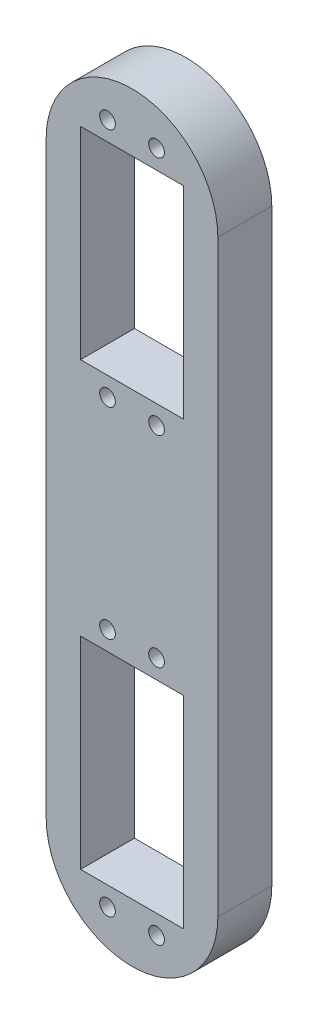
ISO-10303-21;
HEADER;
FILE_DESCRIPTION(('STEP AP214'),'2;1');
FILE_NAME('part.step','',(''),(''),'','','');
FILE_SCHEMA(('AUTOMOTIVE_DESIGN { 1 0 10303 214 1 1 1 1 }'));
ENDSEC;
DATA;
#1=APPLICATION_CONTEXT('core data for automotive mechanical design processes');
#2=APPLICATION_PROTOCOL_DEFINITION('international standard','automotive_design',2000,#1);
#3=PRODUCT_CONTEXT('',#1,'mechanical');
#4=PRODUCT('Part','Part','',(#3));
#5=PRODUCT_RELATED_PRODUCT_CATEGORY('part','',(#4));
#6=PRODUCT_DEFINITION_FORMATION('','',#4);
#7=PRODUCT_DEFINITION_CONTEXT('part definition',#1,'design');
#8=PRODUCT_DEFINITION('design','',#6,#7);
#9=PRODUCT_DEFINITION_SHAPE('','',#8);
#10=(LENGTH_UNIT() NAMED_UNIT(*) SI_UNIT(.MILLI.,.METRE.));
#11=(NAMED_UNIT(*) PLANE_ANGLE_UNIT() SI_UNIT($,.RADIAN.));
#12=(NAMED_UNIT(*) SI_UNIT($,.STERADIAN.) SOLID_ANGLE_UNIT());
#13=UNCERTAINTY_MEASURE_WITH_UNIT(LENGTH_MEASURE(1.E-05),#10,'distance_accuracy_value','');
#14=(GEOMETRIC_REPRESENTATION_CONTEXT(3) GLOBAL_UNCERTAINTY_ASSIGNED_CONTEXT((#13)) GLOBAL_UNIT_ASSIGNED_CONTEXT((#10,
#11,#12)) REPRESENTATION_CONTEXT('',''));
#15=CARTESIAN_POINT('',(0.,0.,0.));
#16=DIRECTION('',(0.,0.,1.));
#17=DIRECTION('',(1.,0.,0.));
#18=AXIS2_PLACEMENT_3D('',#15,#16,#17);
#19=CARTESIAN_POINT('',(-2.50000000000001,-50.,11.));
#20=DIRECTION('',(0.,0.,1.));
#21=DIRECTION('',(1.,0.,0.));
#22=AXIS2_PLACEMENT_3D('',#19,#20,#21);
#23=PLANE('',#22);
#24=CARTESIAN_POINT('',(2.49999999999999,-59.5,11.));
#25=DIRECTION('',(0.,0.,1.));
#26=DIRECTION('',(1.,0.,0.));
#27=AXIS2_PLACEMENT_3D('',#24,#25,#26);
#28=CIRCLE('',#27,1.6);
#29=CARTESIAN_POINT('',(4.09999999999999,-59.5,11.));
#30=VERTEX_POINT('',#29);
#31=EDGE_CURVE('E375',#30,#30,#28,.T.);
#32=ORIENTED_EDGE('',*,*,#31,.F.);
#33=EDGE_LOOP('',(#32));
#34=FACE_BOUND('',#33,.T.);
#35=CARTESIAN_POINT('',(2.49999999999999,-10.5,11.));
#36=DIRECTION('',(0.,0.,1.));
#37=DIRECTION('',(1.,0.,0.));
#38=AXIS2_PLACEMENT_3D('',#35,#36,#37);
#39=CIRCLE('',#38,1.6);
#40=CARTESIAN_POINT('',(4.09999999999999,-10.5,11.));
#41=VERTEX_POINT('',#40);
#42=EDGE_CURVE('E171',#41,#41,#39,.T.);
#43=ORIENTED_EDGE('',*,*,#42,.F.);
#44=EDGE_LOOP('',(#43));
#45=FACE_BOUND('',#44,.T.);
#46=DIRECTION('',(1.,0.,0.));
#47=VECTOR('',#46,1.);
#48=CARTESIAN_POINT('',(0.,-14.4,11.));
#49=LINE('',#48,#47);
#50=CARTESIAN_POINT('',(-13.,-14.4,11.));
#51=VERTEX_POINT('',#50);
#52=CARTESIAN_POINT('',(8.,-14.4,11.));
#53=VERTEX_POINT('',#52);
#54=EDGE_CURVE('E149',#51,#53,#49,.T.);
#55=ORIENTED_EDGE('',*,*,#54,.T.);
#56=DIRECTION('',(0.,-1.,0.));
#57=VECTOR('',#56,1.);
#58=CARTESIAN_POINT('',(8.,0.,11.));
#59=LINE('',#58,#57);
#60=CARTESIAN_POINT('',(7.99999999999998,-55.6,11.));
#61=VERTEX_POINT('',#60);
#62=EDGE_CURVE('E135',#53,#61,#59,.T.);
#63=ORIENTED_EDGE('',*,*,#62,.T.);
#64=DIRECTION('',(1.,0.,0.));
#65=VECTOR('',#64,1.);
#66=CARTESIAN_POINT('',(0.,-55.6,11.));
#67=LINE('',#66,#65);
#68=CARTESIAN_POINT('',(-13.,-55.6,11.));
#69=VERTEX_POINT('',#68);
#70=EDGE_CURVE('E169',#69,#61,#67,.T.);
#71=ORIENTED_EDGE('',*,*,#70,.F.);
#72=DIRECTION('',(0.,1.,0.));
#73=VECTOR('',#72,1.);
#74=CARTESIAN_POINT('',(-13.,0.,11.));
#75=LINE('',#74,#73);
#76=EDGE_CURVE('E157',#69,#51,#75,.T.);
#77=ORIENTED_EDGE('',*,*,#76,.T.);
#78=EDGE_LOOP('',(#55,#63,#71,#77));
#79=FACE_BOUND('',#78,.T.);
#80=CARTESIAN_POINT('',(2.49999999999999,30.5,11.));
#81=DIRECTION('',(0.,0.,1.));
#82=DIRECTION('',(1.,0.,0.));
#83=AXIS2_PLACEMENT_3D('',#80,#81,#82);
#84=CIRCLE('',#83,1.6);
#85=CARTESIAN_POINT('',(4.09999999999999,30.5,11.));
#86=VERTEX_POINT('',#85);
#87=EDGE_CURVE('E221',#86,#86,#84,.T.);
#88=ORIENTED_EDGE('',*,*,#87,.F.);
#89=EDGE_LOOP('',(#88));
#90=FACE_BOUND('',#89,.T.);
#91=CARTESIAN_POINT('',(-7.50000000000001,79.5,11.));
#92=DIRECTION('',(0.,0.,1.));
#93=DIRECTION('',(1.,0.,0.));
#94=AXIS2_PLACEMENT_3D('',#91,#92,#93);
#95=CIRCLE('',#94,1.6);
#96=CARTESIAN_POINT('',(-5.90000000000001,79.5,11.));
#97=VERTEX_POINT('',#96);
#98=EDGE_CURVE('E237',#97,#97,#95,.T.);
#99=ORIENTED_EDGE('',*,*,#98,.F.);
#100=EDGE_LOOP('',(#99));
#101=FACE_BOUND('',#100,.T.);
#102=CARTESIAN_POINT('',(-2.50000000000001,-50.,11.));
#103=DIRECTION('',(0.,0.,1.));
#104=DIRECTION('',(1.,0.,0.));
#105=AXIS2_PLACEMENT_3D('',#102,#103,#104);
#106=CIRCLE('',#105,17.5);
#107=CARTESIAN_POINT('',(-20.,-50.,11.));
#108=VERTEX_POINT('',#107);
#109=CARTESIAN_POINT('',(15.,-50.,11.));
#110=VERTEX_POINT('',#109);
#111=EDGE_CURVE('E257',#108,#110,#106,.T.);
#112=ORIENTED_EDGE('',*,*,#111,.T.);
#113=DIRECTION('',(0.,1.,0.));
#114=VECTOR('',#113,1.);
#115=CARTESIAN_POINT('',(15.,70.,11.));
#116=LINE('',#115,#114);
#117=CARTESIAN_POINT('',(15.,70.,11.));
#118=VERTEX_POINT('',#117);
#119=EDGE_CURVE('E261',#110,#118,#116,.T.);
#120=ORIENTED_EDGE('',*,*,#119,.T.);
#121=CARTESIAN_POINT('',(-2.50000000000001,70.,11.));
#122=DIRECTION('',(0.,0.,1.));
#123=DIRECTION('',(1.,0.,0.));
#124=AXIS2_PLACEMENT_3D('',#121,#122,#123);
#125=CIRCLE('',#124,17.5);
#126=CARTESIAN_POINT('',(-20.,70.,11.));
#127=VERTEX_POINT('',#126);
#128=EDGE_CURVE('E265',#118,#127,#125,.T.);
#129=ORIENTED_EDGE('',*,*,#128,.T.);
#130=DIRECTION('',(0.,-1.,0.));
#131=VECTOR('',#130,1.);
#132=CARTESIAN_POINT('',(-20.,70.,11.));
#133=LINE('',#132,#131);
#134=EDGE_CURVE('E268',#127,#108,#133,.T.);
#135=ORIENTED_EDGE('',*,*,#134,.T.);
#136=EDGE_LOOP('',(#112,#120,#129,#135));
#137=FACE_BOUND('',#136,.T.);
#138=CARTESIAN_POINT('',(2.49999999999999,79.5,11.));
#139=DIRECTION('',(0.,0.,1.));
#140=DIRECTION('',(-1.,0.,0.));
#141=AXIS2_PLACEMENT_3D('',#138,#139,#140);
#142=CIRCLE('',#141,1.6);
#143=CARTESIAN_POINT('',(0.899999999999986,79.5,11.));
#144=VERTEX_POINT('',#143);
#145=EDGE_CURVE('E229',#144,#144,#142,.T.);
#146=ORIENTED_EDGE('',*,*,#145,.F.);
#147=EDGE_LOOP('',(#146));
#148=FACE_BOUND('',#147,.T.);
#149=CARTESIAN_POINT('',(-7.50000000000001,30.5,11.));
#150=DIRECTION('',(0.,0.,1.));
#151=DIRECTION('',(-1.,0.,0.));
#152=AXIS2_PLACEMENT_3D('',#149,#150,#151);
#153=CIRCLE('',#152,1.6);
#154=CARTESIAN_POINT('',(-9.10000000000001,30.5,11.));
#155=VERTEX_POINT('',#154);
#156=EDGE_CURVE('E213',#155,#155,#153,.T.);
#157=ORIENTED_EDGE('',*,*,#156,.F.);
#158=EDGE_LOOP('',(#157));
#159=FACE_BOUND('',#158,.T.);
#160=DIRECTION('',(1.,0.,0.));
#161=VECTOR('',#160,1.);
#162=CARTESIAN_POINT('',(0.,75.6,11.));
#163=LINE('',#162,#161);
#164=CARTESIAN_POINT('',(-13.,75.6,11.));
#165=VERTEX_POINT('',#164);
#166=CARTESIAN_POINT('',(8.,75.6,11.));
#167=VERTEX_POINT('',#166);
#168=EDGE_CURVE('E186',#165,#167,#163,.T.);
#169=ORIENTED_EDGE('',*,*,#168,.T.);
#170=DIRECTION('',(0.,1.,0.));
#171=VECTOR('',#170,1.);
#172=CARTESIAN_POINT('',(7.99999999999999,75.5,11.));
#173=LINE('',#172,#171);
#174=CARTESIAN_POINT('',(8.00000000000001,34.4,11.));
#175=VERTEX_POINT('',#174);
#176=EDGE_CURVE('E248',#175,#167,#173,.T.);
#177=ORIENTED_EDGE('',*,*,#176,.F.);
#178=DIRECTION('',(1.,0.,0.));
#179=VECTOR('',#178,1.);
#180=CARTESIAN_POINT('',(0.,34.4,11.));
#181=LINE('',#180,#179);
#182=CARTESIAN_POINT('',(-13.,34.4,11.));
#183=VERTEX_POINT('',#182);
#184=EDGE_CURVE('E180',#183,#175,#181,.T.);
#185=ORIENTED_EDGE('',*,*,#184,.F.);
#186=DIRECTION('',(0.,-1.,0.));
#187=VECTOR('',#186,1.);
#188=CARTESIAN_POINT('',(-13.,75.5,11.));
#189=LINE('',#188,#187);
#190=EDGE_CURVE('E245',#165,#183,#189,.T.);
#191=ORIENTED_EDGE('',*,*,#190,.F.);
#192=EDGE_LOOP('',(#169,#177,#185,#191));
#193=FACE_BOUND('',#192,.T.);
#194=CARTESIAN_POINT('',(-7.50000000000001,-10.5,11.));
#195=DIRECTION('',(0.,0.,1.));
#196=DIRECTION('',(1.,0.,0.));
#197=AXIS2_PLACEMENT_3D('',#194,#195,#196);
#198=CIRCLE('',#197,1.6);
#199=CARTESIAN_POINT('',(-5.90000000000001,-10.5,11.));
#200=VERTEX_POINT('',#199);
#201=EDGE_CURVE('E363',#200,#200,#198,.T.);
#202=ORIENTED_EDGE('',*,*,#201,.F.);
#203=EDGE_LOOP('',(#202));
#204=FACE_BOUND('',#203,.T.);
#205=CARTESIAN_POINT('',(-7.50000000000001,-59.5,11.));
#206=DIRECTION('',(0.,0.,1.));
#207=DIRECTION('',(1.,0.,0.));
#208=AXIS2_PLACEMENT_3D('',#205,#206,#207);
#209=CIRCLE('',#208,1.6);
#210=CARTESIAN_POINT('',(-5.90000000000001,-59.5,11.));
#211=VERTEX_POINT('',#210);
#212=EDGE_CURVE('E366',#211,#211,#209,.T.);
#213=ORIENTED_EDGE('',*,*,#212,.F.);
#214=EDGE_LOOP('',(#213));
#215=FACE_BOUND('',#214,.T.);
#216=ADVANCED_FACE('F44',(#34,#45,#79,#90,#101,#137,#148,#159,#193,#204,#215),#23,.T.);
#217=CARTESIAN_POINT('',(-2.50000000000001,-50.,0.));
#218=DIRECTION('',(0.,0.,1.));
#219=DIRECTION('',(1.,0.,0.));
#220=AXIS2_PLACEMENT_3D('',#217,#218,#219);
#221=PLANE('',#220);
#222=DIRECTION('',(0.,-1.,0.));
#223=VECTOR('',#222,1.);
#224=CARTESIAN_POINT('',(8.,0.,0.));
#225=LINE('',#224,#223);
#226=CARTESIAN_POINT('',(8.,-14.4,0.));
#227=VERTEX_POINT('',#226);
#228=CARTESIAN_POINT('',(7.99999999999998,-55.6,0.));
#229=VERTEX_POINT('',#228);
#230=EDGE_CURVE('E159',#227,#229,#225,.T.);
#231=ORIENTED_EDGE('',*,*,#230,.F.);
#232=DIRECTION('',(1.,0.,0.));
#233=VECTOR('',#232,1.);
#234=CARTESIAN_POINT('',(0.,-14.4,0.));
#235=LINE('',#234,#233);
#236=CARTESIAN_POINT('',(-13.,-14.4,0.));
#237=VERTEX_POINT('',#236);
#238=EDGE_CURVE('E152',#237,#227,#235,.T.);
#239=ORIENTED_EDGE('',*,*,#238,.F.);
#240=DIRECTION('',(0.,1.,0.));
#241=VECTOR('',#240,1.);
#242=CARTESIAN_POINT('',(-13.,0.,0.));
#243=LINE('',#242,#241);
#244=CARTESIAN_POINT('',(-13.,-55.6,0.));
#245=VERTEX_POINT('',#244);
#246=EDGE_CURVE('E165',#245,#237,#243,.T.);
#247=ORIENTED_EDGE('',*,*,#246,.F.);
#248=DIRECTION('',(1.,0.,0.));
#249=VECTOR('',#248,1.);
#250=CARTESIAN_POINT('',(0.,-55.6,0.));
#251=LINE('',#250,#249);
#252=EDGE_CURVE('E68',#245,#229,#251,.T.);
#253=ORIENTED_EDGE('',*,*,#252,.T.);
#254=EDGE_LOOP('',(#231,#239,#247,#253));
#255=FACE_BOUND('',#254,.T.);
#256=CARTESIAN_POINT('',(-2.50000000000001,-50.,0.));
#257=DIRECTION('',(0.,0.,1.));
#258=DIRECTION('',(1.,0.,0.));
#259=AXIS2_PLACEMENT_3D('',#256,#257,#258);
#260=CIRCLE('',#259,17.5);
#261=CARTESIAN_POINT('',(-20.,-50.,0.));
#262=VERTEX_POINT('',#261);
#263=CARTESIAN_POINT('',(15.,-50.,0.));
#264=VERTEX_POINT('',#263);
#265=EDGE_CURVE('E252',#262,#264,#260,.T.);
#266=ORIENTED_EDGE('',*,*,#265,.F.);
#267=DIRECTION('',(0.,-1.,0.));
#268=VECTOR('',#267,1.);
#269=CARTESIAN_POINT('',(-20.,70.,0.));
#270=LINE('',#269,#268);
#271=CARTESIAN_POINT('',(-20.,70.,0.));
#272=VERTEX_POINT('',#271);
#273=EDGE_CURVE('E262',#272,#262,#270,.T.);
#274=ORIENTED_EDGE('',*,*,#273,.F.);
#275=CARTESIAN_POINT('',(-2.50000000000001,70.,0.));
#276=DIRECTION('',(0.,0.,1.));
#277=DIRECTION('',(1.,0.,0.));
#278=AXIS2_PLACEMENT_3D('',#275,#276,#277);
#279=CIRCLE('',#278,17.5);
#280=CARTESIAN_POINT('',(15.,70.,0.));
#281=VERTEX_POINT('',#280);
#282=EDGE_CURVE('E278',#281,#272,#279,.T.);
#283=ORIENTED_EDGE('',*,*,#282,.F.);
#284=DIRECTION('',(0.,1.,0.));
#285=VECTOR('',#284,1.);
#286=CARTESIAN_POINT('',(15.,70.,0.));
#287=LINE('',#286,#285);
#288=EDGE_CURVE('E275',#264,#281,#287,.T.);
#289=ORIENTED_EDGE('',*,*,#288,.F.);
#290=EDGE_LOOP('',(#266,#274,#283,#289));
#291=FACE_BOUND('',#290,.T.);
#292=CARTESIAN_POINT('',(-7.50000000000001,79.5,0.));
#293=DIRECTION('',(0.,0.,1.));
#294=DIRECTION('',(1.,0.,0.));
#295=AXIS2_PLACEMENT_3D('',#292,#293,#294);
#296=CIRCLE('',#295,1.6);
#297=CARTESIAN_POINT('',(-5.90000000000001,79.5,0.));
#298=VERTEX_POINT('',#297);
#299=EDGE_CURVE('E233',#298,#298,#296,.T.);
#300=ORIENTED_EDGE('',*,*,#299,.T.);
#301=EDGE_LOOP('',(#300));
#302=FACE_BOUND('',#301,.T.);
#303=CARTESIAN_POINT('',(2.49999999999999,79.5,0.));
#304=DIRECTION('',(0.,0.,1.));
#305=DIRECTION('',(-1.,0.,0.));
#306=AXIS2_PLACEMENT_3D('',#303,#304,#305);
#307=CIRCLE('',#306,1.6);
#308=CARTESIAN_POINT('',(0.899999999999986,79.5,0.));
#309=VERTEX_POINT('',#308);
#310=EDGE_CURVE('E225',#309,#309,#307,.T.);
#311=ORIENTED_EDGE('',*,*,#310,.T.);
#312=EDGE_LOOP('',(#311));
#313=FACE_BOUND('',#312,.T.);
#314=CARTESIAN_POINT('',(2.49999999999999,30.5,0.));
#315=DIRECTION('',(0.,0.,1.));
#316=DIRECTION('',(1.,0.,0.));
#317=AXIS2_PLACEMENT_3D('',#314,#315,#316);
#318=CIRCLE('',#317,1.6);
#319=CARTESIAN_POINT('',(4.09999999999999,30.5,0.));
#320=VERTEX_POINT('',#319);
#321=EDGE_CURVE('E217',#320,#320,#318,.T.);
#322=ORIENTED_EDGE('',*,*,#321,.T.);
#323=EDGE_LOOP('',(#322));
#324=FACE_BOUND('',#323,.T.);
#325=CARTESIAN_POINT('',(-7.50000000000001,30.5,0.));
#326=DIRECTION('',(0.,0.,1.));
#327=DIRECTION('',(-1.,0.,0.));
#328=AXIS2_PLACEMENT_3D('',#325,#326,#327);
#329=CIRCLE('',#328,1.6);
#330=CARTESIAN_POINT('',(-9.10000000000001,30.5,0.));
#331=VERTEX_POINT('',#330);
#332=EDGE_CURVE('E195',#331,#331,#329,.T.);
#333=ORIENTED_EDGE('',*,*,#332,.T.);
#334=EDGE_LOOP('',(#333));
#335=FACE_BOUND('',#334,.T.);
#336=DIRECTION('',(0.,1.,0.));
#337=VECTOR('',#336,1.);
#338=CARTESIAN_POINT('',(7.99999999999999,75.5,0.));
#339=LINE('',#338,#337);
#340=CARTESIAN_POINT('',(8.00000000000001,34.4,0.));
#341=VERTEX_POINT('',#340);
#342=CARTESIAN_POINT('',(8.,75.6,0.));
#343=VERTEX_POINT('',#342);
#344=EDGE_CURVE('E249',#341,#343,#339,.T.);
#345=ORIENTED_EDGE('',*,*,#344,.T.);
#346=DIRECTION('',(1.,0.,0.));
#347=VECTOR('',#346,1.);
#348=CARTESIAN_POINT('',(0.,75.6,0.));
#349=LINE('',#348,#347);
#350=CARTESIAN_POINT('',(-13.,75.6,0.));
#351=VERTEX_POINT('',#350);
#352=EDGE_CURVE('E181',#351,#343,#349,.T.);
#353=ORIENTED_EDGE('',*,*,#352,.F.);
#354=DIRECTION('',(0.,-1.,0.));
#355=VECTOR('',#354,1.);
#356=CARTESIAN_POINT('',(-13.,75.5,0.));
#357=LINE('',#356,#355);
#358=CARTESIAN_POINT('',(-13.,34.4,0.));
#359=VERTEX_POINT('',#358);
#360=EDGE_CURVE('E241',#351,#359,#357,.T.);
#361=ORIENTED_EDGE('',*,*,#360,.T.);
#362=DIRECTION('',(1.,0.,0.));
#363=VECTOR('',#362,1.);
#364=CARTESIAN_POINT('',(0.,34.4,0.));
#365=LINE('',#364,#363);
#366=EDGE_CURVE('E199',#359,#341,#365,.T.);
#367=ORIENTED_EDGE('',*,*,#366,.T.);
#368=EDGE_LOOP('',(#345,#353,#361,#367));
#369=FACE_BOUND('',#368,.T.);
#370=CARTESIAN_POINT('',(2.49999999999999,-10.5,0.));
#371=DIRECTION('',(0.,0.,-1.));
#372=DIRECTION('',(-1.,0.,0.));
#373=AXIS2_PLACEMENT_3D('',#370,#371,#372);
#374=CIRCLE('',#373,1.6);
#375=CARTESIAN_POINT('',(0.899999999999988,-10.5,0.));
#376=VERTEX_POINT('',#375);
#377=EDGE_CURVE('E637',#376,#376,#374,.F.);
#378=ORIENTED_EDGE('',*,*,#377,.T.);
#379=EDGE_LOOP('',(#378));
#380=FACE_BOUND('',#379,.T.);
#381=CARTESIAN_POINT('',(-7.50000000000001,-10.5,0.));
#382=DIRECTION('',(0.,0.,-1.));
#383=DIRECTION('',(-1.,0.,0.));
#384=AXIS2_PLACEMENT_3D('',#381,#382,#383);
#385=CIRCLE('',#384,1.6);
#386=CARTESIAN_POINT('',(-9.10000000000001,-10.5,0.));
#387=VERTEX_POINT('',#386);
#388=EDGE_CURVE('E631',#387,#387,#385,.F.);
#389=ORIENTED_EDGE('',*,*,#388,.T.);
#390=EDGE_LOOP('',(#389));
#391=FACE_BOUND('',#390,.T.);
#392=CARTESIAN_POINT('',(2.49999999999999,-59.5,0.));
#393=DIRECTION('',(0.,0.,-1.));
#394=DIRECTION('',(-1.,0.,0.));
#395=AXIS2_PLACEMENT_3D('',#392,#393,#394);
#396=CIRCLE('',#395,1.6);
#397=CARTESIAN_POINT('',(0.899999999999986,-59.5,0.));
#398=VERTEX_POINT('',#397);
#399=EDGE_CURVE('E369',#398,#398,#396,.F.);
#400=ORIENTED_EDGE('',*,*,#399,.T.);
#401=EDGE_LOOP('',(#400));
#402=FACE_BOUND('',#401,.T.);
#403=CARTESIAN_POINT('',(-7.50000000000001,-59.5,0.));
#404=DIRECTION('',(0.,0.,-1.));
#405=DIRECTION('',(-1.,0.,0.));
#406=AXIS2_PLACEMENT_3D('',#403,#404,#405);
#407=CIRCLE('',#406,1.6);
#408=CARTESIAN_POINT('',(-9.10000000000001,-59.5,0.));
#409=VERTEX_POINT('',#408);
#410=EDGE_CURVE('E370',#409,#409,#407,.F.);
#411=ORIENTED_EDGE('',*,*,#410,.T.);
#412=EDGE_LOOP('',(#411));
#413=FACE_BOUND('',#412,.T.);
#414=ADVANCED_FACE('F301',(#255,#291,#302,#313,#324,#335,#369,#380,#391,#402,#413),#221,.F.);
#415=CARTESIAN_POINT('',(-2.50000000000001,-50.,11.));
#416=DIRECTION('',(0.,0.,-1.));
#417=DIRECTION('',(-1.,0.,0.));
#418=AXIS2_PLACEMENT_3D('',#415,#416,#417);
#419=CYLINDRICAL_SURFACE('',#418,17.5);
#420=ORIENTED_EDGE('',*,*,#265,.T.);
#421=DIRECTION('',(0.,0.,-1.));
#422=VECTOR('',#421,1.);
#423=CARTESIAN_POINT('',(15.,-50.,11.));
#424=LINE('',#423,#422);
#425=EDGE_CURVE('E11',#110,#264,#424,.T.);
#426=ORIENTED_EDGE('',*,*,#425,.F.);
#427=ORIENTED_EDGE('',*,*,#111,.F.);
#428=DIRECTION('',(0.,0.,-1.));
#429=VECTOR('',#428,1.);
#430=CARTESIAN_POINT('',(-20.,-50.,11.));
#431=LINE('',#430,#429);
#432=EDGE_CURVE('E271',#108,#262,#431,.T.);
#433=ORIENTED_EDGE('',*,*,#432,.T.);
#434=EDGE_LOOP('',(#420,#426,#427,#433));
#435=FACE_BOUND('',#434,.T.);
#436=ADVANCED_FACE('F46',(#435),#419,.T.);
#437=CARTESIAN_POINT('',(15.,70.,11.));
#438=DIRECTION('',(-1.,0.,0.));
#439=DIRECTION('',(0.,0.,1.));
#440=AXIS2_PLACEMENT_3D('',#437,#438,#439);
#441=PLANE('',#440);
#442=ORIENTED_EDGE('',*,*,#288,.T.);
#443=DIRECTION('',(0.,0.,-1.));
#444=VECTOR('',#443,1.);
#445=CARTESIAN_POINT('',(15.,70.,11.));
#446=LINE('',#445,#444);
#447=EDGE_CURVE('E53',#118,#281,#446,.T.);
#448=ORIENTED_EDGE('',*,*,#447,.F.);
#449=ORIENTED_EDGE('',*,*,#119,.F.);
#450=ORIENTED_EDGE('',*,*,#425,.T.);
#451=EDGE_LOOP('',(#442,#448,#449,#450));
#452=FACE_BOUND('',#451,.T.);
#453=ADVANCED_FACE('F312',(#452),#441,.F.);
#454=CARTESIAN_POINT('',(-2.50000000000001,70.,11.));
#455=DIRECTION('',(0.,0.,-1.));
#456=DIRECTION('',(-1.,0.,0.));
#457=AXIS2_PLACEMENT_3D('',#454,#455,#456);
#458=CYLINDRICAL_SURFACE('',#457,17.5);
#459=ORIENTED_EDGE('',*,*,#282,.T.);
#460=DIRECTION('',(0.,0.,-1.));
#461=VECTOR('',#460,1.);
#462=CARTESIAN_POINT('',(-20.,70.,11.));
#463=LINE('',#462,#461);
#464=EDGE_CURVE('E286',#127,#272,#463,.T.);
#465=ORIENTED_EDGE('',*,*,#464,.F.);
#466=ORIENTED_EDGE('',*,*,#128,.F.);
#467=ORIENTED_EDGE('',*,*,#447,.T.);
#468=EDGE_LOOP('',(#459,#465,#466,#467));
#469=FACE_BOUND('',#468,.T.);
#470=ADVANCED_FACE('F295',(#469),#458,.T.);
#471=CARTESIAN_POINT('',(-20.,70.,11.));
#472=DIRECTION('',(1.,0.,0.));
#473=DIRECTION('',(0.,0.,-1.));
#474=AXIS2_PLACEMENT_3D('',#471,#472,#473);
#475=PLANE('',#474);
#476=ORIENTED_EDGE('',*,*,#273,.T.);
#477=ORIENTED_EDGE('',*,*,#432,.F.);
#478=ORIENTED_EDGE('',*,*,#134,.F.);
#479=ORIENTED_EDGE('',*,*,#464,.T.);
#480=EDGE_LOOP('',(#476,#477,#478,#479));
#481=FACE_BOUND('',#480,.T.);
#482=ADVANCED_FACE('F305',(#481),#475,.F.);
#483=CARTESIAN_POINT('',(-13.,75.5,11.));
#484=DIRECTION('',(1.,0.,0.));
#485=DIRECTION('',(0.,1.,0.));
#486=AXIS2_PLACEMENT_3D('',#483,#484,#485);
#487=PLANE('',#486);
#488=ORIENTED_EDGE('',*,*,#360,.F.);
#489=DIRECTION('',(0.,0.,1.));
#490=VECTOR('',#489,1.);
#491=CARTESIAN_POINT('',(-13.,75.6,0.));
#492=LINE('',#491,#490);
#493=EDGE_CURVE('E191',#351,#165,#492,.T.);
#494=ORIENTED_EDGE('',*,*,#493,.T.);
#495=ORIENTED_EDGE('',*,*,#190,.T.);
#496=DIRECTION('',(0.,0.,1.));
#497=VECTOR('',#496,1.);
#498=CARTESIAN_POINT('',(-13.,34.4,0.));
#499=LINE('',#498,#497);
#500=EDGE_CURVE('E203',#359,#183,#499,.T.);
#501=ORIENTED_EDGE('',*,*,#500,.F.);
#502=EDGE_LOOP('',(#488,#494,#495,#501));
#503=FACE_BOUND('',#502,.T.);
#504=ADVANCED_FACE('F330',(#503),#487,.T.);
#505=CARTESIAN_POINT('',(7.99999999999999,75.5,11.));
#506=DIRECTION('',(-1.,0.,0.));
#507=DIRECTION('',(0.,-1.,0.));
#508=AXIS2_PLACEMENT_3D('',#505,#506,#507);
#509=PLANE('',#508);
#510=ORIENTED_EDGE('',*,*,#344,.F.);
#511=DIRECTION('',(0.,0.,1.));
#512=VECTOR('',#511,1.);
#513=CARTESIAN_POINT('',(8.00000000000001,34.4,0.));
#514=LINE('',#513,#512);
#515=EDGE_CURVE('E190',#341,#175,#514,.T.);
#516=ORIENTED_EDGE('',*,*,#515,.T.);
#517=ORIENTED_EDGE('',*,*,#176,.T.);
#518=DIRECTION('',(0.,0.,1.));
#519=VECTOR('',#518,1.);
#520=CARTESIAN_POINT('',(8.,75.6,0.));
#521=LINE('',#520,#519);
#522=EDGE_CURVE('E185',#343,#167,#521,.T.);
#523=ORIENTED_EDGE('',*,*,#522,.F.);
#524=EDGE_LOOP('',(#510,#516,#517,#523));
#525=FACE_BOUND('',#524,.T.);
#526=ADVANCED_FACE('F337',(#525),#509,.T.);
#527=CARTESIAN_POINT('',(-7.50000000000001,79.5,11.));
#528=DIRECTION('',(0.,0.,-1.));
#529=DIRECTION('',(-1.,0.,0.));
#530=AXIS2_PLACEMENT_3D('',#527,#528,#529);
#531=CYLINDRICAL_SURFACE('',#530,1.6);
#532=ORIENTED_EDGE('',*,*,#98,.T.);
#533=EDGE_LOOP('',(#532));
#534=FACE_BOUND('',#533,.T.);
#535=ORIENTED_EDGE('',*,*,#299,.F.);
#536=EDGE_LOOP('',(#535));
#537=FACE_BOUND('',#536,.T.);
#538=ADVANCED_FACE('F342',(#534,#537),#531,.F.);
#539=CARTESIAN_POINT('',(2.49999999999999,79.5,11.));
#540=DIRECTION('',(0.,0.,-1.));
#541=DIRECTION('',(-1.,0.,0.));
#542=AXIS2_PLACEMENT_3D('',#539,#540,#541);
#543=CYLINDRICAL_SURFACE('',#542,1.6);
#544=ORIENTED_EDGE('',*,*,#145,.T.);
#545=EDGE_LOOP('',(#544));
#546=FACE_BOUND('',#545,.T.);
#547=ORIENTED_EDGE('',*,*,#310,.F.);
#548=EDGE_LOOP('',(#547));
#549=FACE_BOUND('',#548,.T.);
#550=ADVANCED_FACE('F411',(#546,#549),#543,.F.);
#551=CARTESIAN_POINT('',(2.49999999999999,30.5,11.));
#552=DIRECTION('',(0.,0.,-1.));
#553=DIRECTION('',(-1.,0.,0.));
#554=AXIS2_PLACEMENT_3D('',#551,#552,#553);
#555=CYLINDRICAL_SURFACE('',#554,1.6);
#556=ORIENTED_EDGE('',*,*,#87,.T.);
#557=EDGE_LOOP('',(#556));
#558=FACE_BOUND('',#557,.T.);
#559=ORIENTED_EDGE('',*,*,#321,.F.);
#560=EDGE_LOOP('',(#559));
#561=FACE_BOUND('',#560,.T.);
#562=ADVANCED_FACE('F407',(#558,#561),#555,.F.);
#563=CARTESIAN_POINT('',(-7.50000000000001,30.5,11.));
#564=DIRECTION('',(0.,0.,-1.));
#565=DIRECTION('',(-1.,0.,0.));
#566=AXIS2_PLACEMENT_3D('',#563,#564,#565);
#567=CYLINDRICAL_SURFACE('',#566,1.6);
#568=ORIENTED_EDGE('',*,*,#156,.T.);
#569=EDGE_LOOP('',(#568));
#570=FACE_BOUND('',#569,.T.);
#571=ORIENTED_EDGE('',*,*,#332,.F.);
#572=EDGE_LOOP('',(#571));
#573=FACE_BOUND('',#572,.T.);
#574=ADVANCED_FACE('F402',(#570,#573),#567,.F.);
#575=CARTESIAN_POINT('',(0.,75.6,0.));
#576=DIRECTION('',(0.,-1.,0.));
#577=DIRECTION('',(0.,0.,-1.));
#578=AXIS2_PLACEMENT_3D('',#575,#576,#577);
#579=PLANE('',#578);
#580=ORIENTED_EDGE('',*,*,#168,.F.);
#581=ORIENTED_EDGE('',*,*,#493,.F.);
#582=ORIENTED_EDGE('',*,*,#352,.T.);
#583=ORIENTED_EDGE('',*,*,#522,.T.);
#584=EDGE_LOOP('',(#580,#581,#582,#583));
#585=FACE_BOUND('',#584,.T.);
#586=ADVANCED_FACE('F351',(#585),#579,.T.);
#587=CARTESIAN_POINT('',(0.,34.4,0.));
#588=DIRECTION('',(0.,-1.,0.));
#589=DIRECTION('',(0.,0.,-1.));
#590=AXIS2_PLACEMENT_3D('',#587,#588,#589);
#591=PLANE('',#590);
#592=ORIENTED_EDGE('',*,*,#184,.T.);
#593=ORIENTED_EDGE('',*,*,#515,.F.);
#594=ORIENTED_EDGE('',*,*,#366,.F.);
#595=ORIENTED_EDGE('',*,*,#500,.T.);
#596=EDGE_LOOP('',(#592,#593,#594,#595));
#597=FACE_BOUND('',#596,.T.);
#598=ADVANCED_FACE('F356',(#597),#591,.F.);
#599=CARTESIAN_POINT('',(0.,-14.4,57.2432697805854));
#600=DIRECTION('',(0.,1.,0.));
#601=DIRECTION('',(-1.,0.,0.));
#602=AXIS2_PLACEMENT_3D('',#599,#600,#601);
#603=PLANE('',#602);
#604=DIRECTION('',(0.,0.,-1.));
#605=VECTOR('',#604,1.);
#606=CARTESIAN_POINT('',(-13.,-14.4,57.2432697805854));
#607=LINE('',#606,#605);
#608=EDGE_CURVE('E60',#51,#237,#607,.T.);
#609=ORIENTED_EDGE('',*,*,#608,.T.);
#610=ORIENTED_EDGE('',*,*,#238,.T.);
#611=DIRECTION('',(0.,0.,-1.));
#612=VECTOR('',#611,1.);
#613=CARTESIAN_POINT('',(8.,-14.4,57.2432697805854));
#614=LINE('',#613,#612);
#615=EDGE_CURVE('E139',#53,#227,#614,.T.);
#616=ORIENTED_EDGE('',*,*,#615,.F.);
#617=ORIENTED_EDGE('',*,*,#54,.F.);
#618=EDGE_LOOP('',(#609,#610,#616,#617));
#619=FACE_BOUND('',#618,.T.);
#620=ADVANCED_FACE('F148',(#619),#603,.F.);
#621=CARTESIAN_POINT('',(8.,0.,57.2432697805854));
#622=DIRECTION('',(1.,0.,0.));
#623=DIRECTION('',(0.,1.,0.));
#624=AXIS2_PLACEMENT_3D('',#621,#622,#623);
#625=PLANE('',#624);
#626=ORIENTED_EDGE('',*,*,#615,.T.);
#627=ORIENTED_EDGE('',*,*,#230,.T.);
#628=DIRECTION('',(0.,0.,-1.));
#629=VECTOR('',#628,1.);
#630=CARTESIAN_POINT('',(7.99999999999998,-55.6,57.2432697805854));
#631=LINE('',#630,#629);
#632=EDGE_CURVE('E141',#61,#229,#631,.T.);
#633=ORIENTED_EDGE('',*,*,#632,.F.);
#634=ORIENTED_EDGE('',*,*,#62,.F.);
#635=EDGE_LOOP('',(#626,#627,#633,#634));
#636=FACE_BOUND('',#635,.T.);
#637=ADVANCED_FACE('F137',(#636),#625,.F.);
#638=CARTESIAN_POINT('',(0.,-55.6,57.2432697805854));
#639=DIRECTION('',(0.,1.,0.));
#640=DIRECTION('',(0.,0.,1.));
#641=AXIS2_PLACEMENT_3D('',#638,#639,#640);
#642=PLANE('',#641);
#643=ORIENTED_EDGE('',*,*,#70,.T.);
#644=ORIENTED_EDGE('',*,*,#632,.T.);
#645=ORIENTED_EDGE('',*,*,#252,.F.);
#646=DIRECTION('',(0.,0.,-1.));
#647=VECTOR('',#646,1.);
#648=CARTESIAN_POINT('',(-13.,-55.6,57.2432697805854));
#649=LINE('',#648,#647);
#650=EDGE_CURVE('E173',#69,#245,#649,.T.);
#651=ORIENTED_EDGE('',*,*,#650,.F.);
#652=EDGE_LOOP('',(#643,#644,#645,#651));
#653=FACE_BOUND('',#652,.T.);
#654=ADVANCED_FACE('F386',(#653),#642,.T.);
#655=CARTESIAN_POINT('',(-13.,0.,57.2432697805854));
#656=DIRECTION('',(-1.,0.,0.));
#657=DIRECTION('',(0.,-1.,0.));
#658=AXIS2_PLACEMENT_3D('',#655,#656,#657);
#659=PLANE('',#658);
#660=ORIENTED_EDGE('',*,*,#650,.T.);
#661=ORIENTED_EDGE('',*,*,#246,.T.);
#662=ORIENTED_EDGE('',*,*,#608,.F.);
#663=ORIENTED_EDGE('',*,*,#76,.F.);
#664=EDGE_LOOP('',(#660,#661,#662,#663));
#665=FACE_BOUND('',#664,.T.);
#666=ADVANCED_FACE('F385',(#665),#659,.F.);
#667=CARTESIAN_POINT('',(2.49999999999999,-10.5,57.2432697805854));
#668=DIRECTION('',(0.,0.,-1.));
#669=DIRECTION('',(-1.,0.,0.));
#670=AXIS2_PLACEMENT_3D('',#667,#668,#669);
#671=CYLINDRICAL_SURFACE('',#670,1.6);
#672=ORIENTED_EDGE('',*,*,#377,.F.);
#673=EDGE_LOOP('',(#672));
#674=FACE_BOUND('',#673,.T.);
#675=ORIENTED_EDGE('',*,*,#42,.T.);
#676=EDGE_LOOP('',(#675));
#677=FACE_BOUND('',#676,.T.);
#678=ADVANCED_FACE('F393',(#674,#677),#671,.F.);
#679=CARTESIAN_POINT('',(-7.50000000000001,-10.5,57.2432697805854));
#680=DIRECTION('',(0.,0.,-1.));
#681=DIRECTION('',(-1.,0.,0.));
#682=AXIS2_PLACEMENT_3D('',#679,#680,#681);
#683=CYLINDRICAL_SURFACE('',#682,1.6);
#684=ORIENTED_EDGE('',*,*,#388,.F.);
#685=EDGE_LOOP('',(#684));
#686=FACE_BOUND('',#685,.T.);
#687=ORIENTED_EDGE('',*,*,#201,.T.);
#688=EDGE_LOOP('',(#687));
#689=FACE_BOUND('',#688,.T.);
#690=ADVANCED_FACE('F487',(#686,#689),#683,.F.);
#691=CARTESIAN_POINT('',(2.49999999999999,-59.5,57.2432697805854));
#692=DIRECTION('',(0.,0.,-1.));
#693=DIRECTION('',(-1.,0.,0.));
#694=AXIS2_PLACEMENT_3D('',#691,#692,#693);
#695=CYLINDRICAL_SURFACE('',#694,1.6);
#696=ORIENTED_EDGE('',*,*,#399,.F.);
#697=EDGE_LOOP('',(#696));
#698=FACE_BOUND('',#697,.T.);
#699=ORIENTED_EDGE('',*,*,#31,.T.);
#700=EDGE_LOOP('',(#699));
#701=FACE_BOUND('',#700,.T.);
#702=ADVANCED_FACE('F498',(#698,#701),#695,.F.);
#703=CARTESIAN_POINT('',(-7.50000000000001,-59.5,57.2432697805854));
#704=DIRECTION('',(0.,0.,-1.));
#705=DIRECTION('',(-1.,0.,0.));
#706=AXIS2_PLACEMENT_3D('',#703,#704,#705);
#707=CYLINDRICAL_SURFACE('',#706,1.6);
#708=ORIENTED_EDGE('',*,*,#410,.F.);
#709=EDGE_LOOP('',(#708));
#710=FACE_BOUND('',#709,.T.);
#711=ORIENTED_EDGE('',*,*,#212,.T.);
#712=EDGE_LOOP('',(#711));
#713=FACE_BOUND('',#712,.T.);
#714=ADVANCED_FACE('F509',(#710,#713),#707,.F.);
#715=CLOSED_SHELL('',(#216,#414,#436,#453,#470,#482,#504,#526,#538,#550,#562,#574,#586,#598,
#620,#637,#654,#666,#678,#690,#702,#714));
#716=MANIFOLD_SOLID_BREP('B2',#715);
#717=ADVANCED_BREP_SHAPE_REPRESENTATION('',(#18,#716),#14);
#718=SHAPE_DEFINITION_REPRESENTATION(#9,#717);
ENDSEC;
END-ISO-10303-21;
